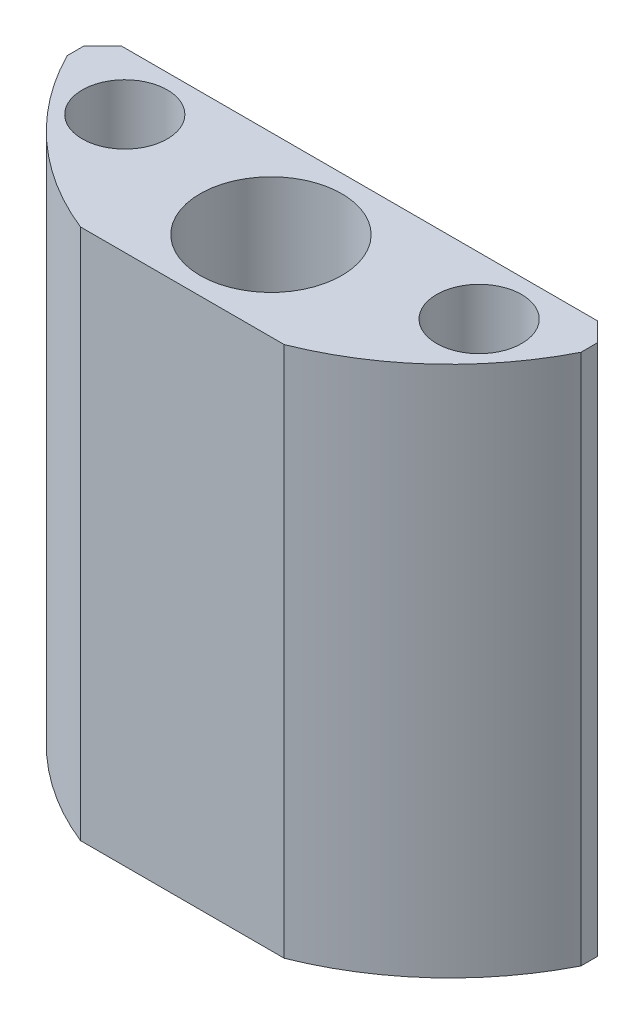
ISO-10303-21;
HEADER;
FILE_DESCRIPTION(('STEP AP214'),'2;1');
FILE_NAME('part.step','',(''),(''),'','','');
FILE_SCHEMA(('AUTOMOTIVE_DESIGN { 1 0 10303 214 1 1 1 1 }'));
ENDSEC;
DATA;
#1=APPLICATION_CONTEXT('core data for automotive mechanical design processes');
#2=APPLICATION_PROTOCOL_DEFINITION('international standard','automotive_design',2000,#1);
#3=PRODUCT_CONTEXT('',#1,'mechanical');
#4=PRODUCT('Part','Part','',(#3));
#5=PRODUCT_RELATED_PRODUCT_CATEGORY('part','',(#4));
#6=PRODUCT_DEFINITION_FORMATION('','',#4);
#7=PRODUCT_DEFINITION_CONTEXT('part definition',#1,'design');
#8=PRODUCT_DEFINITION('design','',#6,#7);
#9=PRODUCT_DEFINITION_SHAPE('','',#8);
#10=(LENGTH_UNIT() NAMED_UNIT(*) SI_UNIT(.MILLI.,.METRE.));
#11=(NAMED_UNIT(*) PLANE_ANGLE_UNIT() SI_UNIT($,.RADIAN.));
#12=(NAMED_UNIT(*) SI_UNIT($,.STERADIAN.) SOLID_ANGLE_UNIT());
#13=UNCERTAINTY_MEASURE_WITH_UNIT(LENGTH_MEASURE(1.E-05),#10,'distance_accuracy_value','');
#14=(GEOMETRIC_REPRESENTATION_CONTEXT(3) GLOBAL_UNCERTAINTY_ASSIGNED_CONTEXT((#13)) GLOBAL_UNIT_ASSIGNED_CONTEXT((#10,
#11,#12)) REPRESENTATION_CONTEXT('',''));
#15=CARTESIAN_POINT('',(0.,0.,0.));
#16=DIRECTION('',(0.,0.,1.));
#17=DIRECTION('',(1.,0.,0.));
#18=AXIS2_PLACEMENT_3D('',#15,#16,#17);
#19=CARTESIAN_POINT('',(20.,-60.,6.5));
#20=DIRECTION('',(0.,1.,0.));
#21=DIRECTION('',(0.,0.,1.));
#22=AXIS2_PLACEMENT_3D('',#19,#20,#21);
#23=CYLINDRICAL_SURFACE('',#22,4.);
#24=CARTESIAN_POINT('',(20.,-60.,6.5));
#25=DIRECTION('',(0.,1.,0.));
#26=DIRECTION('',(0.,0.,1.));
#27=AXIS2_PLACEMENT_3D('',#24,#25,#26);
#28=CIRCLE('',#27,4.);
#29=CARTESIAN_POINT('',(20.,-60.,10.5));
#30=VERTEX_POINT('',#29);
#31=EDGE_CURVE('E174',#30,#30,#28,.T.);
#32=ORIENTED_EDGE('',*,*,#31,.F.);
#33=EDGE_LOOP('',(#32));
#34=FACE_BOUND('',#33,.T.);
#35=CARTESIAN_POINT('',(20.,-48.,6.5));
#36=DIRECTION('',(0.,1.,0.));
#37=DIRECTION('',(0.,0.,1.));
#38=AXIS2_PLACEMENT_3D('',#35,#36,#37);
#39=CIRCLE('',#38,4.);
#40=CARTESIAN_POINT('',(20.,-48.,10.5));
#41=VERTEX_POINT('',#40);
#42=EDGE_CURVE('E42',#41,#41,#39,.F.);
#43=ORIENTED_EDGE('',*,*,#42,.F.);
#44=EDGE_LOOP('',(#43));
#45=FACE_BOUND('',#44,.T.);
#46=ADVANCED_FACE('F38',(#34,#45),#23,.F.);
#47=CARTESIAN_POINT('',(-20.,-60.,6.5));
#48=DIRECTION('',(0.,1.,0.));
#49=DIRECTION('',(0.,0.,1.));
#50=AXIS2_PLACEMENT_3D('',#47,#48,#49);
#51=CYLINDRICAL_SURFACE('',#50,4.);
#52=CARTESIAN_POINT('',(-20.,-60.,6.5));
#53=DIRECTION('',(0.,1.,0.));
#54=DIRECTION('',(0.,0.,1.));
#55=AXIS2_PLACEMENT_3D('',#52,#53,#54);
#56=CIRCLE('',#55,4.);
#57=CARTESIAN_POINT('',(-20.,-60.,10.5));
#58=VERTEX_POINT('',#57);
#59=EDGE_CURVE('E140',#58,#58,#56,.T.);
#60=ORIENTED_EDGE('',*,*,#59,.F.);
#61=EDGE_LOOP('',(#60));
#62=FACE_BOUND('',#61,.T.);
#63=CARTESIAN_POINT('',(-20.,-48.,6.5));
#64=DIRECTION('',(0.,1.,0.));
#65=DIRECTION('',(0.,0.,1.));
#66=AXIS2_PLACEMENT_3D('',#63,#64,#65);
#67=CIRCLE('',#66,4.);
#68=CARTESIAN_POINT('',(-20.,-48.,10.5));
#69=VERTEX_POINT('',#68);
#70=EDGE_CURVE('E168',#69,#69,#67,.F.);
#71=ORIENTED_EDGE('',*,*,#70,.F.);
#72=EDGE_LOOP('',(#71));
#73=FACE_BOUND('',#72,.T.);
#74=ADVANCED_FACE('F225',(#62,#73),#51,.F.);
#75=CARTESIAN_POINT('',(-26.8786796564404,-60.,0.));
#76=DIRECTION('',(-0.707106781186551,0.,-0.707106781186544));
#77=DIRECTION('',(-0.707106781186544,0.,0.707106781186551));
#78=AXIS2_PLACEMENT_3D('',#75,#76,#77);
#79=PLANE('',#78);
#80=DIRECTION('',(-0.707106781186544,0.,0.707106781186551));
#81=VECTOR('',#80,1.);
#82=CARTESIAN_POINT('',(-26.8786796564404,0.,0.));
#83=LINE('',#82,#81);
#84=CARTESIAN_POINT('',(-26.8786796564404,0.,0.));
#85=VERTEX_POINT('',#84);
#86=CARTESIAN_POINT('',(-29.,0.,2.12132034355965));
#87=VERTEX_POINT('',#86);
#88=EDGE_CURVE('E136',#85,#87,#83,.T.);
#89=ORIENTED_EDGE('',*,*,#88,.F.);
#90=DIRECTION('',(0.,1.,0.));
#91=VECTOR('',#90,1.);
#92=CARTESIAN_POINT('',(-26.8786796564404,-60.,0.));
#93=LINE('',#92,#91);
#94=CARTESIAN_POINT('',(-26.8786796564404,-60.,0.));
#95=VERTEX_POINT('',#94);
#96=EDGE_CURVE('E12',#95,#85,#93,.T.);
#97=ORIENTED_EDGE('',*,*,#96,.F.);
#98=DIRECTION('',(-0.707106781186544,0.,0.707106781186551));
#99=VECTOR('',#98,1.);
#100=CARTESIAN_POINT('',(-26.8786796564404,-60.,0.));
#101=LINE('',#100,#99);
#102=CARTESIAN_POINT('',(-29.,-60.,2.12132034355965));
#103=VERTEX_POINT('',#102);
#104=EDGE_CURVE('E157',#95,#103,#101,.T.);
#105=ORIENTED_EDGE('',*,*,#104,.T.);
#106=DIRECTION('',(0.,1.,0.));
#107=VECTOR('',#106,1.);
#108=CARTESIAN_POINT('',(-29.,-60.,2.12132034355965));
#109=LINE('',#108,#107);
#110=EDGE_CURVE('E95',#103,#87,#109,.T.);
#111=ORIENTED_EDGE('',*,*,#110,.T.);
#112=EDGE_LOOP('',(#89,#97,#105,#111));
#113=FACE_BOUND('',#112,.T.);
#114=ADVANCED_FACE('F40',(#113),#79,.T.);
#115=CARTESIAN_POINT('',(-26.8786796564404,-60.,0.));
#116=DIRECTION('',(0.,0.,-1.));
#117=DIRECTION('',(-1.,0.,0.));
#118=AXIS2_PLACEMENT_3D('',#115,#116,#117);
#119=PLANE('',#118);
#120=DIRECTION('',(-1.,0.,0.));
#121=VECTOR('',#120,1.);
#122=CARTESIAN_POINT('',(-26.8786796564404,0.,0.));
#123=LINE('',#122,#121);
#124=CARTESIAN_POINT('',(26.8786796564404,0.,0.));
#125=VERTEX_POINT('',#124);
#126=EDGE_CURVE('E155',#125,#85,#123,.T.);
#127=ORIENTED_EDGE('',*,*,#126,.F.);
#128=DIRECTION('',(0.,1.,0.));
#129=VECTOR('',#128,1.);
#130=CARTESIAN_POINT('',(26.8786796564404,-60.,0.));
#131=LINE('',#130,#129);
#132=CARTESIAN_POINT('',(26.8786796564404,-60.,0.));
#133=VERTEX_POINT('',#132);
#134=EDGE_CURVE('E48',#133,#125,#131,.T.);
#135=ORIENTED_EDGE('',*,*,#134,.F.);
#136=DIRECTION('',(-1.,0.,0.));
#137=VECTOR('',#136,1.);
#138=CARTESIAN_POINT('',(-26.8786796564404,-60.,0.));
#139=LINE('',#138,#137);
#140=EDGE_CURVE('E126',#133,#95,#139,.T.);
#141=ORIENTED_EDGE('',*,*,#140,.T.);
#142=ORIENTED_EDGE('',*,*,#96,.T.);
#143=EDGE_LOOP('',(#127,#135,#141,#142));
#144=FACE_BOUND('',#143,.T.);
#145=ADVANCED_FACE('F217',(#144),#119,.T.);
#146=CARTESIAN_POINT('',(26.8786796564404,-60.,0.));
#147=DIRECTION('',(0.707106781186551,0.,-0.707106781186544));
#148=DIRECTION('',(-0.707106781186544,0.,-0.707106781186551));
#149=AXIS2_PLACEMENT_3D('',#146,#147,#148);
#150=PLANE('',#149);
#151=DIRECTION('',(-0.707106781186544,0.,-0.707106781186551));
#152=VECTOR('',#151,1.);
#153=CARTESIAN_POINT('',(26.8786796564404,0.,0.));
#154=LINE('',#153,#152);
#155=CARTESIAN_POINT('',(29.,0.,2.12132034355965));
#156=VERTEX_POINT('',#155);
#157=EDGE_CURVE('E114',#156,#125,#154,.T.);
#158=ORIENTED_EDGE('',*,*,#157,.F.);
#159=DIRECTION('',(0.,1.,0.));
#160=VECTOR('',#159,1.);
#161=CARTESIAN_POINT('',(29.,-60.,2.12132034355965));
#162=LINE('',#161,#160);
#163=CARTESIAN_POINT('',(29.,-60.,2.12132034355965));
#164=VERTEX_POINT('',#163);
#165=EDGE_CURVE('E109',#164,#156,#162,.T.);
#166=ORIENTED_EDGE('',*,*,#165,.F.);
#167=DIRECTION('',(-0.707106781186544,0.,-0.707106781186551));
#168=VECTOR('',#167,1.);
#169=CARTESIAN_POINT('',(26.8786796564404,-60.,0.));
#170=LINE('',#169,#168);
#171=EDGE_CURVE('E112',#164,#133,#170,.T.);
#172=ORIENTED_EDGE('',*,*,#171,.T.);
#173=ORIENTED_EDGE('',*,*,#134,.T.);
#174=EDGE_LOOP('',(#158,#166,#172,#173));
#175=FACE_BOUND('',#174,.T.);
#176=ADVANCED_FACE('F111',(#175),#150,.T.);
#177=CARTESIAN_POINT('',(29.,-60.,2.12132034355965));
#178=DIRECTION('',(1.,0.,0.));
#179=DIRECTION('',(0.,0.,-1.));
#180=AXIS2_PLACEMENT_3D('',#177,#178,#179);
#181=PLANE('',#180);
#182=DIRECTION('',(0.,0.,-1.));
#183=VECTOR('',#182,1.);
#184=CARTESIAN_POINT('',(29.,0.,2.12132034355965));
#185=LINE('',#184,#183);
#186=CARTESIAN_POINT('',(29.,0.,4.));
#187=VERTEX_POINT('',#186);
#188=EDGE_CURVE('E152',#187,#156,#185,.T.);
#189=ORIENTED_EDGE('',*,*,#188,.F.);
#190=DIRECTION('',(0.,1.,0.));
#191=VECTOR('',#190,1.);
#192=CARTESIAN_POINT('',(29.,-60.,4.));
#193=LINE('',#192,#191);
#194=CARTESIAN_POINT('',(29.,-60.,4.));
#195=VERTEX_POINT('',#194);
#196=EDGE_CURVE('E119',#195,#187,#193,.T.);
#197=ORIENTED_EDGE('',*,*,#196,.F.);
#198=DIRECTION('',(0.,0.,-1.));
#199=VECTOR('',#198,1.);
#200=CARTESIAN_POINT('',(29.,-60.,2.12132034355965));
#201=LINE('',#200,#199);
#202=EDGE_CURVE('E124',#195,#164,#201,.T.);
#203=ORIENTED_EDGE('',*,*,#202,.T.);
#204=ORIENTED_EDGE('',*,*,#165,.T.);
#205=EDGE_LOOP('',(#189,#197,#203,#204));
#206=FACE_BOUND('',#205,.T.);
#207=ADVANCED_FACE('F128',(#206),#181,.T.);
#208=CARTESIAN_POINT('',(-0.891796155637472,-60.,-11.1238395452285));
#209=DIRECTION('',(0.,1.,0.));
#210=DIRECTION('',(0.,0.,1.));
#211=AXIS2_PLACEMENT_3D('',#208,#209,#210);
#212=CYLINDRICAL_SURFACE('',#211,33.5);
#213=CARTESIAN_POINT('',(-0.891796155637472,0.,-11.1238395452285));
#214=DIRECTION('',(0.,1.,0.));
#215=DIRECTION('',(0.,0.,-1.));
#216=AXIS2_PLACEMENT_3D('',#213,#214,#215);
#217=CIRCLE('',#216,33.5);
#218=CARTESIAN_POINT('',(11.5,0.,20.));
#219=VERTEX_POINT('',#218);
#220=EDGE_CURVE('E149',#219,#187,#217,.T.);
#221=ORIENTED_EDGE('',*,*,#220,.F.);
#222=DIRECTION('',(0.,1.,0.));
#223=VECTOR('',#222,1.);
#224=CARTESIAN_POINT('',(11.5,-60.,20.));
#225=LINE('',#224,#223);
#226=CARTESIAN_POINT('',(11.5,-60.,20.));
#227=VERTEX_POINT('',#226);
#228=EDGE_CURVE('E162',#227,#219,#225,.T.);
#229=ORIENTED_EDGE('',*,*,#228,.F.);
#230=CARTESIAN_POINT('',(-0.891796155637472,-60.,-11.1238395452285));
#231=DIRECTION('',(0.,1.,0.));
#232=DIRECTION('',(0.,0.,-1.));
#233=AXIS2_PLACEMENT_3D('',#230,#231,#232);
#234=CIRCLE('',#233,33.5);
#235=EDGE_CURVE('E129',#227,#195,#234,.T.);
#236=ORIENTED_EDGE('',*,*,#235,.T.);
#237=ORIENTED_EDGE('',*,*,#196,.T.);
#238=EDGE_LOOP('',(#221,#229,#236,#237));
#239=FACE_BOUND('',#238,.T.);
#240=ADVANCED_FACE('F338',(#239),#212,.T.);
#241=CARTESIAN_POINT('',(11.5,-60.,20.));
#242=DIRECTION('',(0.,0.,1.));
#243=DIRECTION('',(1.,0.,0.));
#244=AXIS2_PLACEMENT_3D('',#241,#242,#243);
#245=PLANE('',#244);
#246=DIRECTION('',(1.,0.,0.));
#247=VECTOR('',#246,1.);
#248=CARTESIAN_POINT('',(11.5,0.,20.));
#249=LINE('',#248,#247);
#250=CARTESIAN_POINT('',(-11.5,0.,20.));
#251=VERTEX_POINT('',#250);
#252=EDGE_CURVE('E146',#251,#219,#249,.T.);
#253=ORIENTED_EDGE('',*,*,#252,.F.);
#254=DIRECTION('',(0.,1.,0.));
#255=VECTOR('',#254,1.);
#256=CARTESIAN_POINT('',(-11.5,-60.,20.));
#257=LINE('',#256,#255);
#258=CARTESIAN_POINT('',(-11.5,-60.,20.));
#259=VERTEX_POINT('',#258);
#260=EDGE_CURVE('E164',#259,#251,#257,.T.);
#261=ORIENTED_EDGE('',*,*,#260,.F.);
#262=DIRECTION('',(1.,0.,0.));
#263=VECTOR('',#262,1.);
#264=CARTESIAN_POINT('',(11.5,-60.,20.));
#265=LINE('',#264,#263);
#266=EDGE_CURVE('E131',#259,#227,#265,.T.);
#267=ORIENTED_EDGE('',*,*,#266,.T.);
#268=ORIENTED_EDGE('',*,*,#228,.T.);
#269=EDGE_LOOP('',(#253,#261,#267,#268));
#270=FACE_BOUND('',#269,.T.);
#271=ADVANCED_FACE('F208',(#270),#245,.T.);
#272=CARTESIAN_POINT('',(0.891796155637472,-60.,-11.1238395452285));
#273=DIRECTION('',(0.,1.,0.));
#274=DIRECTION('',(0.,0.,1.));
#275=AXIS2_PLACEMENT_3D('',#272,#273,#274);
#276=CYLINDRICAL_SURFACE('',#275,33.5);
#277=CARTESIAN_POINT('',(0.891796155637472,0.,-11.1238395452285));
#278=DIRECTION('',(0.,1.,0.));
#279=DIRECTION('',(0.,0.,1.));
#280=AXIS2_PLACEMENT_3D('',#277,#278,#279);
#281=CIRCLE('',#280,33.5);
#282=CARTESIAN_POINT('',(-29.,0.,3.99999999999999));
#283=VERTEX_POINT('',#282);
#284=EDGE_CURVE('E143',#283,#251,#281,.T.);
#285=ORIENTED_EDGE('',*,*,#284,.F.);
#286=DIRECTION('',(0.,1.,0.));
#287=VECTOR('',#286,1.);
#288=CARTESIAN_POINT('',(-29.,-60.,3.99999999999999));
#289=LINE('',#288,#287);
#290=CARTESIAN_POINT('',(-29.,-60.,3.99999999999999));
#291=VERTEX_POINT('',#290);
#292=EDGE_CURVE('E166',#291,#283,#289,.T.);
#293=ORIENTED_EDGE('',*,*,#292,.F.);
#294=CARTESIAN_POINT('',(0.891796155637472,-60.,-11.1238395452285));
#295=DIRECTION('',(0.,1.,0.));
#296=DIRECTION('',(0.,0.,1.));
#297=AXIS2_PLACEMENT_3D('',#294,#295,#296);
#298=CIRCLE('',#297,33.5);
#299=EDGE_CURVE('E202',#291,#259,#298,.T.);
#300=ORIENTED_EDGE('',*,*,#299,.T.);
#301=ORIENTED_EDGE('',*,*,#260,.T.);
#302=EDGE_LOOP('',(#285,#293,#300,#301));
#303=FACE_BOUND('',#302,.T.);
#304=ADVANCED_FACE('F213',(#303),#276,.T.);
#305=CARTESIAN_POINT('',(-29.,-60.,2.12132034355965));
#306=DIRECTION('',(-1.,0.,0.));
#307=DIRECTION('',(0.,0.,1.));
#308=AXIS2_PLACEMENT_3D('',#305,#306,#307);
#309=PLANE('',#308);
#310=DIRECTION('',(0.,0.,1.));
#311=VECTOR('',#310,1.);
#312=CARTESIAN_POINT('',(-29.,0.,2.12132034355965));
#313=LINE('',#312,#311);
#314=EDGE_CURVE('E139',#87,#283,#313,.T.);
#315=ORIENTED_EDGE('',*,*,#314,.F.);
#316=ORIENTED_EDGE('',*,*,#110,.F.);
#317=DIRECTION('',(0.,0.,1.));
#318=VECTOR('',#317,1.);
#319=CARTESIAN_POINT('',(-29.,-60.,2.12132034355965));
#320=LINE('',#319,#318);
#321=EDGE_CURVE('E200',#103,#291,#320,.T.);
#322=ORIENTED_EDGE('',*,*,#321,.T.);
#323=ORIENTED_EDGE('',*,*,#292,.T.);
#324=EDGE_LOOP('',(#315,#316,#322,#323));
#325=FACE_BOUND('',#324,.T.);
#326=ADVANCED_FACE('F214',(#325),#309,.T.);
#327=CARTESIAN_POINT('',(0.891796155637472,-60.,-11.1238395452285));
#328=DIRECTION('',(0.,1.,0.));
#329=DIRECTION('',(0.,0.,1.));
#330=AXIS2_PLACEMENT_3D('',#327,#328,#329);
#331=PLANE('',#330);
#332=ORIENTED_EDGE('',*,*,#59,.T.);
#333=EDGE_LOOP('',(#332));
#334=FACE_BOUND('',#333,.T.);
#335=CARTESIAN_POINT('',(0.,-60.,10.));
#336=DIRECTION('',(0.,1.,0.));
#337=DIRECTION('',(0.,0.,1.));
#338=AXIS2_PLACEMENT_3D('',#335,#336,#337);
#339=CIRCLE('',#338,8.);
#340=CARTESIAN_POINT('',(0.,-60.,18.));
#341=VERTEX_POINT('',#340);
#342=EDGE_CURVE('E191',#341,#341,#339,.T.);
#343=ORIENTED_EDGE('',*,*,#342,.T.);
#344=EDGE_LOOP('',(#343));
#345=FACE_BOUND('',#344,.T.);
#346=ORIENTED_EDGE('',*,*,#31,.T.);
#347=EDGE_LOOP('',(#346));
#348=FACE_BOUND('',#347,.T.);
#349=ORIENTED_EDGE('',*,*,#104,.F.);
#350=ORIENTED_EDGE('',*,*,#140,.F.);
#351=ORIENTED_EDGE('',*,*,#171,.F.);
#352=ORIENTED_EDGE('',*,*,#202,.F.);
#353=ORIENTED_EDGE('',*,*,#235,.F.);
#354=ORIENTED_EDGE('',*,*,#266,.F.);
#355=ORIENTED_EDGE('',*,*,#299,.F.);
#356=ORIENTED_EDGE('',*,*,#321,.F.);
#357=EDGE_LOOP('',(#349,#350,#351,#352,#353,#354,#355,#356));
#358=FACE_BOUND('',#357,.T.);
#359=ADVANCED_FACE('F122',(#334,#345,#348,#358),#331,.F.);
#360=CARTESIAN_POINT('',(0.891796155637472,0.,-11.1238395452285));
#361=DIRECTION('',(0.,1.,0.));
#362=DIRECTION('',(0.,0.,1.));
#363=AXIS2_PLACEMENT_3D('',#360,#361,#362);
#364=PLANE('',#363);
#365=CARTESIAN_POINT('',(-20.,0.,6.5));
#366=DIRECTION('',(0.,1.,0.));
#367=DIRECTION('',(0.,0.,1.));
#368=AXIS2_PLACEMENT_3D('',#365,#366,#367);
#369=CIRCLE('',#368,4.8);
#370=CARTESIAN_POINT('',(-20.,0.,11.3));
#371=VERTEX_POINT('',#370);
#372=EDGE_CURVE('E176',#371,#371,#369,.T.);
#373=ORIENTED_EDGE('',*,*,#372,.F.);
#374=EDGE_LOOP('',(#373));
#375=FACE_BOUND('',#374,.T.);
#376=CARTESIAN_POINT('',(20.,0.,6.5));
#377=DIRECTION('',(0.,1.,0.));
#378=DIRECTION('',(0.,0.,1.));
#379=AXIS2_PLACEMENT_3D('',#376,#377,#378);
#380=CIRCLE('',#379,4.8);
#381=CARTESIAN_POINT('',(20.,0.,11.3));
#382=VERTEX_POINT('',#381);
#383=EDGE_CURVE('E186',#382,#382,#380,.T.);
#384=ORIENTED_EDGE('',*,*,#383,.F.);
#385=EDGE_LOOP('',(#384));
#386=FACE_BOUND('',#385,.T.);
#387=CARTESIAN_POINT('',(0.,0.,10.));
#388=DIRECTION('',(0.,1.,0.));
#389=DIRECTION('',(0.,0.,1.));
#390=AXIS2_PLACEMENT_3D('',#387,#388,#389);
#391=CIRCLE('',#390,8.);
#392=CARTESIAN_POINT('',(0.,0.,18.));
#393=VERTEX_POINT('',#392);
#394=EDGE_CURVE('E194',#393,#393,#391,.T.);
#395=ORIENTED_EDGE('',*,*,#394,.F.);
#396=EDGE_LOOP('',(#395));
#397=FACE_BOUND('',#396,.T.);
#398=ORIENTED_EDGE('',*,*,#88,.T.);
#399=ORIENTED_EDGE('',*,*,#314,.T.);
#400=ORIENTED_EDGE('',*,*,#284,.T.);
#401=ORIENTED_EDGE('',*,*,#252,.T.);
#402=ORIENTED_EDGE('',*,*,#220,.T.);
#403=ORIENTED_EDGE('',*,*,#188,.T.);
#404=ORIENTED_EDGE('',*,*,#157,.T.);
#405=ORIENTED_EDGE('',*,*,#126,.T.);
#406=EDGE_LOOP('',(#398,#399,#400,#401,#402,#403,#404,#405));
#407=FACE_BOUND('',#406,.T.);
#408=ADVANCED_FACE('F216',(#375,#386,#397,#407),#364,.T.);
#409=CARTESIAN_POINT('',(0.,-60.,10.));
#410=DIRECTION('',(0.,1.,0.));
#411=DIRECTION('',(0.,0.,1.));
#412=AXIS2_PLACEMENT_3D('',#409,#410,#411);
#413=CYLINDRICAL_SURFACE('',#412,8.);
#414=ORIENTED_EDGE('',*,*,#342,.F.);
#415=EDGE_LOOP('',(#414));
#416=FACE_BOUND('',#415,.T.);
#417=ORIENTED_EDGE('',*,*,#394,.T.);
#418=EDGE_LOOP('',(#417));
#419=FACE_BOUND('',#418,.T.);
#420=ADVANCED_FACE('F239',(#416,#419),#413,.F.);
#421=CARTESIAN_POINT('',(-20.,-48.,6.5));
#422=DIRECTION('',(0.,1.,0.));
#423=DIRECTION('',(0.,0.,1.));
#424=AXIS2_PLACEMENT_3D('',#421,#422,#423);
#425=PLANE('',#424);
#426=CARTESIAN_POINT('',(-20.,-48.,6.5));
#427=DIRECTION('',(0.,1.,0.));
#428=DIRECTION('',(0.,0.,1.));
#429=AXIS2_PLACEMENT_3D('',#426,#427,#428);
#430=CIRCLE('',#429,4.8);
#431=CARTESIAN_POINT('',(-20.,-48.,11.3));
#432=VERTEX_POINT('',#431);
#433=EDGE_CURVE('E170',#432,#432,#430,.T.);
#434=ORIENTED_EDGE('',*,*,#433,.T.);
#435=EDGE_LOOP('',(#434));
#436=FACE_BOUND('',#435,.T.);
#437=ORIENTED_EDGE('',*,*,#70,.T.);
#438=EDGE_LOOP('',(#437));
#439=FACE_BOUND('',#438,.T.);
#440=ADVANCED_FACE('F247',(#436,#439),#425,.T.);
#441=CARTESIAN_POINT('',(-20.,-48.,6.5));
#442=DIRECTION('',(0.,1.,0.));
#443=DIRECTION('',(0.,0.,1.));
#444=AXIS2_PLACEMENT_3D('',#441,#442,#443);
#445=CYLINDRICAL_SURFACE('',#444,4.8);
#446=ORIENTED_EDGE('',*,*,#433,.F.);
#447=EDGE_LOOP('',(#446));
#448=FACE_BOUND('',#447,.T.);
#449=ORIENTED_EDGE('',*,*,#372,.T.);
#450=EDGE_LOOP('',(#449));
#451=FACE_BOUND('',#450,.T.);
#452=ADVANCED_FACE('F264',(#448,#451),#445,.F.);
#453=CARTESIAN_POINT('',(20.,-48.,6.5));
#454=DIRECTION('',(0.,1.,0.));
#455=DIRECTION('',(0.,0.,1.));
#456=AXIS2_PLACEMENT_3D('',#453,#454,#455);
#457=PLANE('',#456);
#458=CARTESIAN_POINT('',(20.,-48.,6.5));
#459=DIRECTION('',(0.,1.,0.));
#460=DIRECTION('',(0.,0.,1.));
#461=AXIS2_PLACEMENT_3D('',#458,#459,#460);
#462=CIRCLE('',#461,4.8);
#463=CARTESIAN_POINT('',(20.,-48.,11.3));
#464=VERTEX_POINT('',#463);
#465=EDGE_CURVE('E181',#464,#464,#462,.T.);
#466=ORIENTED_EDGE('',*,*,#465,.T.);
#467=EDGE_LOOP('',(#466));
#468=FACE_BOUND('',#467,.T.);
#469=ORIENTED_EDGE('',*,*,#42,.T.);
#470=EDGE_LOOP('',(#469));
#471=FACE_BOUND('',#470,.T.);
#472=ADVANCED_FACE('F258',(#468,#471),#457,.T.);
#473=CARTESIAN_POINT('',(20.,-48.,6.5));
#474=DIRECTION('',(0.,1.,0.));
#475=DIRECTION('',(0.,0.,1.));
#476=AXIS2_PLACEMENT_3D('',#473,#474,#475);
#477=CYLINDRICAL_SURFACE('',#476,4.8);
#478=ORIENTED_EDGE('',*,*,#465,.F.);
#479=EDGE_LOOP('',(#478));
#480=FACE_BOUND('',#479,.T.);
#481=ORIENTED_EDGE('',*,*,#383,.T.);
#482=EDGE_LOOP('',(#481));
#483=FACE_BOUND('',#482,.T.);
#484=ADVANCED_FACE('F256',(#480,#483),#477,.F.);
#485=CLOSED_SHELL('',(#46,#74,#114,#145,#176,#207,#240,#271,#304,#326,#359,#408,#420,#440,#452,
#472,#484));
#486=MANIFOLD_SOLID_BREP('B2',#485);
#487=ADVANCED_BREP_SHAPE_REPRESENTATION('',(#18,#486),#14);
#488=SHAPE_DEFINITION_REPRESENTATION(#9,#487);
ENDSEC;
END-ISO-10303-21;
